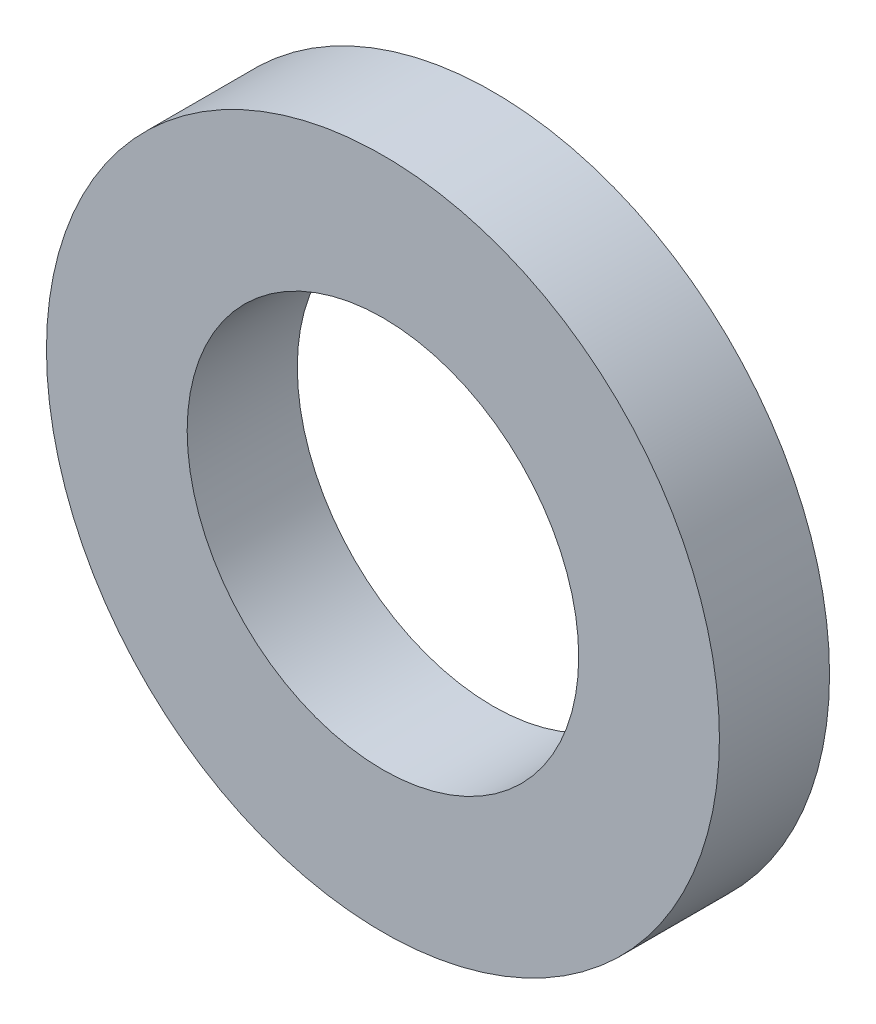
ISO-10303-21;
HEADER;
FILE_DESCRIPTION(('STEP AP214'),'2;1');
FILE_NAME('part.step','',(''),(''),'','','');
FILE_SCHEMA(('AUTOMOTIVE_DESIGN { 1 0 10303 214 1 1 1 1 }'));
ENDSEC;
DATA;
#1=APPLICATION_CONTEXT('core data for automotive mechanical design processes');
#2=APPLICATION_PROTOCOL_DEFINITION('international standard','automotive_design',2000,#1);
#3=PRODUCT_CONTEXT('',#1,'mechanical');
#4=PRODUCT('Part','Part','',(#3));
#5=PRODUCT_RELATED_PRODUCT_CATEGORY('part','',(#4));
#6=PRODUCT_DEFINITION_FORMATION('','',#4);
#7=PRODUCT_DEFINITION_CONTEXT('part definition',#1,'design');
#8=PRODUCT_DEFINITION('design','',#6,#7);
#9=PRODUCT_DEFINITION_SHAPE('','',#8);
#10=(LENGTH_UNIT() NAMED_UNIT(*) SI_UNIT(.MILLI.,.METRE.));
#11=(NAMED_UNIT(*) PLANE_ANGLE_UNIT() SI_UNIT($,.RADIAN.));
#12=(NAMED_UNIT(*) SI_UNIT($,.STERADIAN.) SOLID_ANGLE_UNIT());
#13=UNCERTAINTY_MEASURE_WITH_UNIT(LENGTH_MEASURE(1.E-05),#10,'distance_accuracy_value','');
#14=(GEOMETRIC_REPRESENTATION_CONTEXT(3) GLOBAL_UNCERTAINTY_ASSIGNED_CONTEXT((#13)) GLOBAL_UNIT_ASSIGNED_CONTEXT((#10,
#11,#12)) REPRESENTATION_CONTEXT('',''));
#15=CARTESIAN_POINT('',(0.,0.,0.));
#16=DIRECTION('',(0.,0.,1.));
#17=DIRECTION('',(1.,0.,0.));
#18=AXIS2_PLACEMENT_3D('',#15,#16,#17);
#19=CARTESIAN_POINT('',(0.,0.,1.8));
#20=DIRECTION('',(0.,0.,1.));
#21=DIRECTION('',(1.,0.,0.));
#22=AXIS2_PLACEMENT_3D('',#19,#20,#21);
#23=PLANE('',#22);
#24=CARTESIAN_POINT('',(0.,0.,1.8));
#25=DIRECTION('',(0.,0.,1.));
#26=DIRECTION('',(1.,0.,0.));
#27=AXIS2_PLACEMENT_3D('',#24,#25,#26);
#28=CIRCLE('',#27,5.5);
#29=CARTESIAN_POINT('',(5.5,0.,1.8));
#30=VERTEX_POINT('',#29);
#31=EDGE_CURVE('E10',#30,#30,#28,.T.);
#32=ORIENTED_EDGE('',*,*,#31,.T.);
#33=EDGE_LOOP('',(#32));
#34=FACE_BOUND('',#33,.T.);
#35=CARTESIAN_POINT('',(0.,0.,1.8));
#36=DIRECTION('',(0.,0.,1.));
#37=DIRECTION('',(1.,0.,0.));
#38=AXIS2_PLACEMENT_3D('',#35,#36,#37);
#39=CIRCLE('',#38,3.2);
#40=CARTESIAN_POINT('',(3.2,0.,1.8));
#41=VERTEX_POINT('',#40);
#42=EDGE_CURVE('E41',#41,#41,#39,.T.);
#43=ORIENTED_EDGE('',*,*,#42,.F.);
#44=EDGE_LOOP('',(#43));
#45=FACE_BOUND('',#44,.T.);
#46=ADVANCED_FACE('F30',(#34,#45),#23,.T.);
#47=CARTESIAN_POINT('',(0.,0.,0.));
#48=DIRECTION('',(0.,0.,1.));
#49=DIRECTION('',(1.,0.,0.));
#50=AXIS2_PLACEMENT_3D('',#47,#48,#49);
#51=PLANE('',#50);
#52=CARTESIAN_POINT('',(0.,0.,0.));
#53=DIRECTION('',(0.,0.,1.));
#54=DIRECTION('',(1.,0.,0.));
#55=AXIS2_PLACEMENT_3D('',#52,#53,#54);
#56=CIRCLE('',#55,5.5);
#57=CARTESIAN_POINT('',(5.5,0.,0.));
#58=VERTEX_POINT('',#57);
#59=EDGE_CURVE('E34',#58,#58,#56,.T.);
#60=ORIENTED_EDGE('',*,*,#59,.F.);
#61=EDGE_LOOP('',(#60));
#62=FACE_BOUND('',#61,.T.);
#63=CARTESIAN_POINT('',(0.,0.,0.));
#64=DIRECTION('',(0.,0.,1.));
#65=DIRECTION('',(1.,0.,0.));
#66=AXIS2_PLACEMENT_3D('',#63,#64,#65);
#67=CIRCLE('',#66,3.2);
#68=CARTESIAN_POINT('',(3.2,0.,0.));
#69=VERTEX_POINT('',#68);
#70=EDGE_CURVE('E43',#69,#69,#67,.T.);
#71=ORIENTED_EDGE('',*,*,#70,.T.);
#72=EDGE_LOOP('',(#71));
#73=FACE_BOUND('',#72,.T.);
#74=ADVANCED_FACE('F53',(#62,#73),#51,.F.);
#75=CARTESIAN_POINT('',(0.,0.,1.8));
#76=DIRECTION('',(0.,0.,-1.));
#77=DIRECTION('',(-1.,0.,0.));
#78=AXIS2_PLACEMENT_3D('',#75,#76,#77);
#79=CYLINDRICAL_SURFACE('',#78,5.5);
#80=ORIENTED_EDGE('',*,*,#31,.F.);
#81=EDGE_LOOP('',(#80));
#82=FACE_BOUND('',#81,.T.);
#83=ORIENTED_EDGE('',*,*,#59,.T.);
#84=EDGE_LOOP('',(#83));
#85=FACE_BOUND('',#84,.T.);
#86=ADVANCED_FACE('F32',(#82,#85),#79,.T.);
#87=CARTESIAN_POINT('',(0.,0.,1.8));
#88=DIRECTION('',(0.,0.,-1.));
#89=DIRECTION('',(-1.,0.,0.));
#90=AXIS2_PLACEMENT_3D('',#87,#88,#89);
#91=CYLINDRICAL_SURFACE('',#90,3.2);
#92=ORIENTED_EDGE('',*,*,#42,.T.);
#93=EDGE_LOOP('',(#92));
#94=FACE_BOUND('',#93,.T.);
#95=ORIENTED_EDGE('',*,*,#70,.F.);
#96=EDGE_LOOP('',(#95));
#97=FACE_BOUND('',#96,.T.);
#98=ADVANCED_FACE('F49',(#94,#97),#91,.F.);
#99=CLOSED_SHELL('',(#46,#74,#86,#98));
#100=MANIFOLD_SOLID_BREP('B2',#99);
#101=ADVANCED_BREP_SHAPE_REPRESENTATION('',(#18,#100),#14);
#102=SHAPE_DEFINITION_REPRESENTATION(#9,#101);
ENDSEC;
END-ISO-10303-21;
